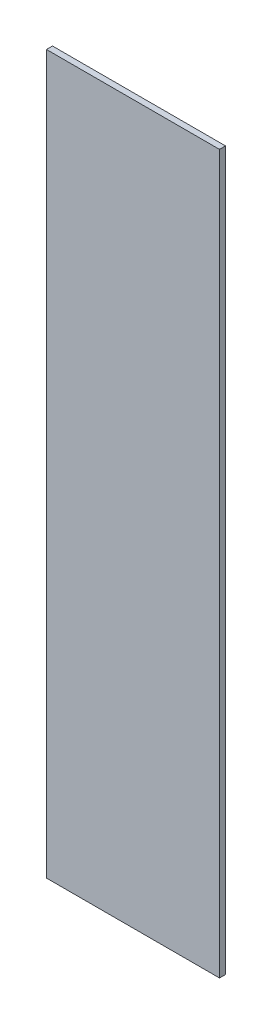
ISO-10303-21;
HEADER;
FILE_DESCRIPTION(('STEP AP214'),'2;1');
FILE_NAME('part.step','',(''),(''),'','','');
FILE_SCHEMA(('AUTOMOTIVE_DESIGN { 1 0 10303 214 1 1 1 1 }'));
ENDSEC;
DATA;
#1=APPLICATION_CONTEXT('core data for automotive mechanical design processes');
#2=APPLICATION_PROTOCOL_DEFINITION('international standard','automotive_design',2000,#1);
#3=PRODUCT_CONTEXT('',#1,'mechanical');
#4=PRODUCT('Part','Part','',(#3));
#5=PRODUCT_RELATED_PRODUCT_CATEGORY('part','',(#4));
#6=PRODUCT_DEFINITION_FORMATION('','',#4);
#7=PRODUCT_DEFINITION_CONTEXT('part definition',#1,'design');
#8=PRODUCT_DEFINITION('design','',#6,#7);
#9=PRODUCT_DEFINITION_SHAPE('','',#8);
#10=(LENGTH_UNIT() NAMED_UNIT(*) SI_UNIT(.MILLI.,.METRE.));
#11=(NAMED_UNIT(*) PLANE_ANGLE_UNIT() SI_UNIT($,.RADIAN.));
#12=(NAMED_UNIT(*) SI_UNIT($,.STERADIAN.) SOLID_ANGLE_UNIT());
#13=UNCERTAINTY_MEASURE_WITH_UNIT(LENGTH_MEASURE(1.E-05),#10,'distance_accuracy_value','');
#14=(GEOMETRIC_REPRESENTATION_CONTEXT(3) GLOBAL_UNCERTAINTY_ASSIGNED_CONTEXT((#13)) GLOBAL_UNIT_ASSIGNED_CONTEXT((#10,
#11,#12)) REPRESENTATION_CONTEXT('',''));
#15=CARTESIAN_POINT('',(0.,0.,0.));
#16=DIRECTION('',(0.,0.,1.));
#17=DIRECTION('',(1.,0.,0.));
#18=AXIS2_PLACEMENT_3D('',#15,#16,#17);
#19=CARTESIAN_POINT('',(57.5,238.5,4.));
#20=DIRECTION('',(-1.,0.,0.));
#21=DIRECTION('',(0.,-1.,0.));
#22=AXIS2_PLACEMENT_3D('',#19,#20,#21);
#23=PLANE('',#22);
#24=DIRECTION('',(0.,1.,0.));
#25=VECTOR('',#24,1.);
#26=CARTESIAN_POINT('',(57.5,238.5,0.));
#27=LINE('',#26,#25);
#28=CARTESIAN_POINT('',(57.5,-238.5,0.));
#29=VERTEX_POINT('',#28);
#30=CARTESIAN_POINT('',(57.5,238.5,0.));
#31=VERTEX_POINT('',#30);
#32=EDGE_CURVE('E95',#29,#31,#27,.T.);
#33=ORIENTED_EDGE('',*,*,#32,.T.);
#34=DIRECTION('',(0.,0.,-1.));
#35=VECTOR('',#34,1.);
#36=CARTESIAN_POINT('',(57.5,238.5,4.));
#37=LINE('',#36,#35);
#38=CARTESIAN_POINT('',(57.5,238.5,4.));
#39=VERTEX_POINT('',#38);
#40=EDGE_CURVE('E11',#39,#31,#37,.T.);
#41=ORIENTED_EDGE('',*,*,#40,.F.);
#42=DIRECTION('',(0.,1.,0.));
#43=VECTOR('',#42,1.);
#44=CARTESIAN_POINT('',(57.5,238.5,4.));
#45=LINE('',#44,#43);
#46=CARTESIAN_POINT('',(57.5,-238.5,4.));
#47=VERTEX_POINT('',#46);
#48=EDGE_CURVE('E83',#47,#39,#45,.T.);
#49=ORIENTED_EDGE('',*,*,#48,.F.);
#50=DIRECTION('',(0.,0.,-1.));
#51=VECTOR('',#50,1.);
#52=CARTESIAN_POINT('',(57.5,-238.5,4.));
#53=LINE('',#52,#51);
#54=EDGE_CURVE('E91',#47,#29,#53,.T.);
#55=ORIENTED_EDGE('',*,*,#54,.T.);
#56=EDGE_LOOP('',(#33,#41,#49,#55));
#57=FACE_BOUND('',#56,.T.);
#58=ADVANCED_FACE('F32',(#57),#23,.F.);
#59=CARTESIAN_POINT('',(-57.5,238.5,4.));
#60=DIRECTION('',(0.,-1.,0.));
#61=DIRECTION('',(0.,0.,-1.));
#62=AXIS2_PLACEMENT_3D('',#59,#60,#61);
#63=PLANE('',#62);
#64=DIRECTION('',(-1.,0.,0.));
#65=VECTOR('',#64,1.);
#66=CARTESIAN_POINT('',(-57.5,238.5,0.));
#67=LINE('',#66,#65);
#68=CARTESIAN_POINT('',(-57.5,238.5,0.));
#69=VERTEX_POINT('',#68);
#70=EDGE_CURVE('E87',#31,#69,#67,.T.);
#71=ORIENTED_EDGE('',*,*,#70,.T.);
#72=DIRECTION('',(0.,0.,-1.));
#73=VECTOR('',#72,1.);
#74=CARTESIAN_POINT('',(-57.5,238.5,4.));
#75=LINE('',#74,#73);
#76=CARTESIAN_POINT('',(-57.5,238.5,4.));
#77=VERTEX_POINT('',#76);
#78=EDGE_CURVE('E40',#77,#69,#75,.T.);
#79=ORIENTED_EDGE('',*,*,#78,.F.);
#80=DIRECTION('',(-1.,0.,0.));
#81=VECTOR('',#80,1.);
#82=CARTESIAN_POINT('',(-57.5,238.5,4.));
#83=LINE('',#82,#81);
#84=EDGE_CURVE('E78',#39,#77,#83,.T.);
#85=ORIENTED_EDGE('',*,*,#84,.F.);
#86=ORIENTED_EDGE('',*,*,#40,.T.);
#87=EDGE_LOOP('',(#71,#79,#85,#86));
#88=FACE_BOUND('',#87,.T.);
#89=ADVANCED_FACE('F86',(#88),#63,.F.);
#90=CARTESIAN_POINT('',(-57.5,238.5,4.));
#91=DIRECTION('',(1.,0.,0.));
#92=DIRECTION('',(0.,1.,0.));
#93=AXIS2_PLACEMENT_3D('',#90,#91,#92);
#94=PLANE('',#93);
#95=DIRECTION('',(0.,-1.,0.));
#96=VECTOR('',#95,1.);
#97=CARTESIAN_POINT('',(-57.5,238.5,0.));
#98=LINE('',#97,#96);
#99=CARTESIAN_POINT('',(-57.5,-238.5,0.));
#100=VERTEX_POINT('',#99);
#101=EDGE_CURVE('E65',#69,#100,#98,.T.);
#102=ORIENTED_EDGE('',*,*,#101,.T.);
#103=DIRECTION('',(0.,0.,-1.));
#104=VECTOR('',#103,1.);
#105=CARTESIAN_POINT('',(-57.5,-238.5,4.));
#106=LINE('',#105,#104);
#107=CARTESIAN_POINT('',(-57.5,-238.5,4.));
#108=VERTEX_POINT('',#107);
#109=EDGE_CURVE('E88',#108,#100,#106,.T.);
#110=ORIENTED_EDGE('',*,*,#109,.F.);
#111=DIRECTION('',(0.,-1.,0.));
#112=VECTOR('',#111,1.);
#113=CARTESIAN_POINT('',(-57.5,238.5,4.));
#114=LINE('',#113,#112);
#115=EDGE_CURVE('E81',#77,#108,#114,.T.);
#116=ORIENTED_EDGE('',*,*,#115,.F.);
#117=ORIENTED_EDGE('',*,*,#78,.T.);
#118=EDGE_LOOP('',(#102,#110,#116,#117));
#119=FACE_BOUND('',#118,.T.);
#120=ADVANCED_FACE('F89',(#119),#94,.F.);
#121=CARTESIAN_POINT('',(-57.5,-238.5,4.));
#122=DIRECTION('',(0.,1.,0.));
#123=DIRECTION('',(0.,0.,1.));
#124=AXIS2_PLACEMENT_3D('',#121,#122,#123);
#125=PLANE('',#124);
#126=DIRECTION('',(1.,0.,0.));
#127=VECTOR('',#126,1.);
#128=CARTESIAN_POINT('',(-57.5,-238.5,0.));
#129=LINE('',#128,#127);
#130=EDGE_CURVE('E71',#100,#29,#129,.T.);
#131=ORIENTED_EDGE('',*,*,#130,.T.);
#132=ORIENTED_EDGE('',*,*,#54,.F.);
#133=DIRECTION('',(1.,0.,0.));
#134=VECTOR('',#133,1.);
#135=CARTESIAN_POINT('',(-57.5,-238.5,4.));
#136=LINE('',#135,#134);
#137=EDGE_CURVE('E48',#108,#47,#136,.T.);
#138=ORIENTED_EDGE('',*,*,#137,.F.);
#139=ORIENTED_EDGE('',*,*,#109,.T.);
#140=EDGE_LOOP('',(#131,#132,#138,#139));
#141=FACE_BOUND('',#140,.T.);
#142=ADVANCED_FACE('F102',(#141),#125,.F.);
#143=CARTESIAN_POINT('',(0.,0.,4.));
#144=DIRECTION('',(0.,0.,1.));
#145=DIRECTION('',(1.,0.,0.));
#146=AXIS2_PLACEMENT_3D('',#143,#144,#145);
#147=PLANE('',#146);
#148=ORIENTED_EDGE('',*,*,#48,.T.);
#149=ORIENTED_EDGE('',*,*,#84,.T.);
#150=ORIENTED_EDGE('',*,*,#115,.T.);
#151=ORIENTED_EDGE('',*,*,#137,.T.);
#152=EDGE_LOOP('',(#148,#149,#150,#151));
#153=FACE_BOUND('',#152,.T.);
#154=ADVANCED_FACE('F79',(#153),#147,.T.);
#155=CARTESIAN_POINT('',(0.,0.,0.));
#156=DIRECTION('',(0.,0.,1.));
#157=DIRECTION('',(1.,0.,0.));
#158=AXIS2_PLACEMENT_3D('',#155,#156,#157);
#159=PLANE('',#158);
#160=ORIENTED_EDGE('',*,*,#32,.F.);
#161=ORIENTED_EDGE('',*,*,#130,.F.);
#162=ORIENTED_EDGE('',*,*,#101,.F.);
#163=ORIENTED_EDGE('',*,*,#70,.F.);
#164=EDGE_LOOP('',(#160,#161,#162,#163));
#165=FACE_BOUND('',#164,.T.);
#166=ADVANCED_FACE('F105',(#165),#159,.F.);
#167=CLOSED_SHELL('',(#58,#89,#120,#142,#154,#166));
#168=MANIFOLD_SOLID_BREP('B2',#167);
#169=ADVANCED_BREP_SHAPE_REPRESENTATION('',(#18,#168),#14);
#170=SHAPE_DEFINITION_REPRESENTATION(#9,#169);
ENDSEC;
END-ISO-10303-21;
